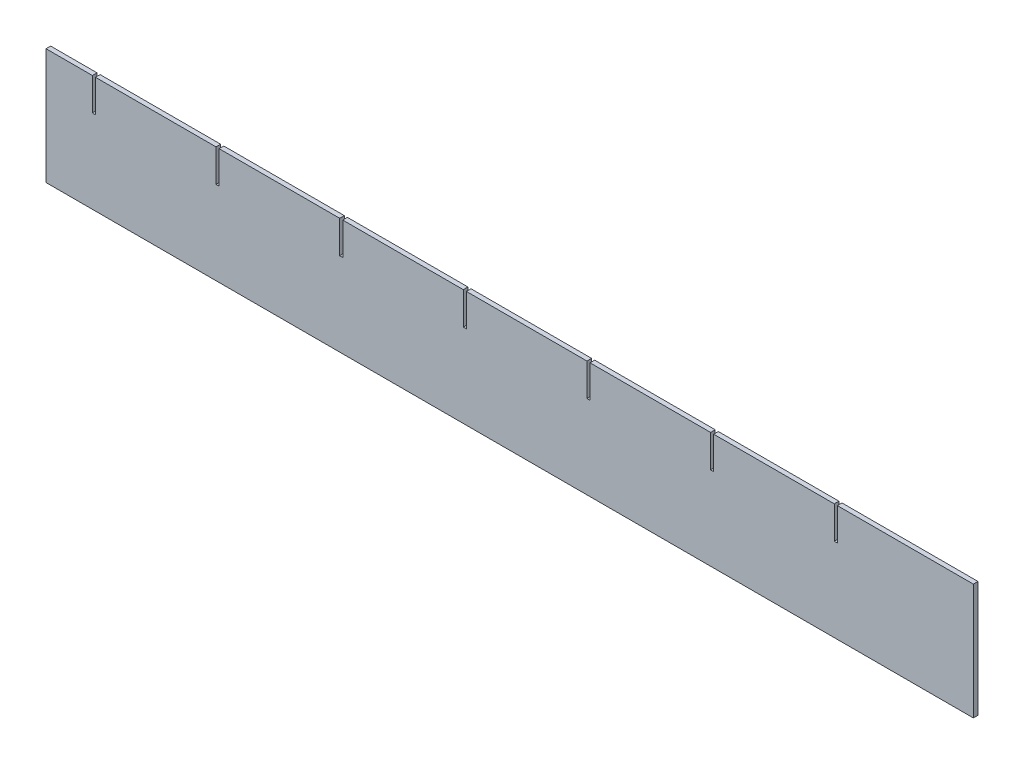
ISO-10303-21;
HEADER;
FILE_DESCRIPTION(('STEP AP214'),'2;1');
FILE_NAME('part.step','',(''),(''),'','','');
FILE_SCHEMA(('AUTOMOTIVE_DESIGN { 1 0 10303 214 1 1 1 1 }'));
ENDSEC;
DATA;
#1=APPLICATION_CONTEXT('core data for automotive mechanical design processes');
#2=APPLICATION_PROTOCOL_DEFINITION('international standard','automotive_design',2000,#1);
#3=PRODUCT_CONTEXT('',#1,'mechanical');
#4=PRODUCT('Part','Part','',(#3));
#5=PRODUCT_RELATED_PRODUCT_CATEGORY('part','',(#4));
#6=PRODUCT_DEFINITION_FORMATION('','',#4);
#7=PRODUCT_DEFINITION_CONTEXT('part definition',#1,'design');
#8=PRODUCT_DEFINITION('design','',#6,#7);
#9=PRODUCT_DEFINITION_SHAPE('','',#8);
#10=(LENGTH_UNIT() NAMED_UNIT(*) SI_UNIT(.MILLI.,.METRE.));
#11=(NAMED_UNIT(*) PLANE_ANGLE_UNIT() SI_UNIT($,.RADIAN.));
#12=(NAMED_UNIT(*) SI_UNIT($,.STERADIAN.) SOLID_ANGLE_UNIT());
#13=UNCERTAINTY_MEASURE_WITH_UNIT(LENGTH_MEASURE(1.E-05),#10,'distance_accuracy_value','');
#14=(GEOMETRIC_REPRESENTATION_CONTEXT(3) GLOBAL_UNCERTAINTY_ASSIGNED_CONTEXT((#13)) GLOBAL_UNIT_ASSIGNED_CONTEXT((#10,
#11,#12)) REPRESENTATION_CONTEXT('',''));
#15=CARTESIAN_POINT('',(0.,0.,0.));
#16=DIRECTION('',(0.,0.,1.));
#17=DIRECTION('',(1.,0.,0.));
#18=AXIS2_PLACEMENT_3D('',#15,#16,#17);
#19=CARTESIAN_POINT('',(0.,16.5,3.));
#20=DIRECTION('',(0.,1.,0.));
#21=DIRECTION('',(0.,0.,1.));
#22=AXIS2_PLACEMENT_3D('',#19,#20,#21);
#23=PLANE('',#22);
#24=DIRECTION('',(1.,0.,0.));
#25=VECTOR('',#24,1.);
#26=CARTESIAN_POINT('',(0.,16.5,0.));
#27=LINE('',#26,#25);
#28=CARTESIAN_POINT('',(210.,16.5,0.));
#29=VERTEX_POINT('',#28);
#30=CARTESIAN_POINT('',(212.,16.5,0.));
#31=VERTEX_POINT('',#30);
#32=EDGE_CURVE('E386',#29,#31,#27,.T.);
#33=ORIENTED_EDGE('',*,*,#32,.F.);
#34=DIRECTION('',(0.,0.,-1.));
#35=VECTOR('',#34,1.);
#36=CARTESIAN_POINT('',(210.,16.5,3.));
#37=LINE('',#36,#35);
#38=CARTESIAN_POINT('',(210.,16.5,3.));
#39=VERTEX_POINT('',#38);
#40=EDGE_CURVE('E11',#39,#29,#37,.T.);
#41=ORIENTED_EDGE('',*,*,#40,.F.);
#42=DIRECTION('',(1.,0.,0.));
#43=VECTOR('',#42,1.);
#44=CARTESIAN_POINT('',(0.,16.5,3.));
#45=LINE('',#44,#43);
#46=CARTESIAN_POINT('',(212.,16.5,3.));
#47=VERTEX_POINT('',#46);
#48=EDGE_CURVE('E304',#39,#47,#45,.T.);
#49=ORIENTED_EDGE('',*,*,#48,.T.);
#50=DIRECTION('',(0.,0.,-1.));
#51=VECTOR('',#50,1.);
#52=CARTESIAN_POINT('',(212.,16.5,3.));
#53=LINE('',#52,#51);
#54=EDGE_CURVE('E168',#47,#31,#53,.T.);
#55=ORIENTED_EDGE('',*,*,#54,.T.);
#56=EDGE_LOOP('',(#33,#41,#49,#55));
#57=FACE_BOUND('',#56,.T.);
#58=ADVANCED_FACE('F45',(#57),#23,.T.);
#59=CARTESIAN_POINT('',(210.,0.,3.));
#60=DIRECTION('',(1.,0.,0.));
#61=DIRECTION('',(0.,0.,-1.));
#62=AXIS2_PLACEMENT_3D('',#59,#60,#61);
#63=PLANE('',#62);
#64=DIRECTION('',(0.,-1.,0.));
#65=VECTOR('',#64,1.);
#66=CARTESIAN_POINT('',(210.,0.,0.));
#67=LINE('',#66,#65);
#68=CARTESIAN_POINT('',(210.,37.5,0.));
#69=VERTEX_POINT('',#68);
#70=EDGE_CURVE('E390',#69,#29,#67,.T.);
#71=ORIENTED_EDGE('',*,*,#70,.F.);
#72=DIRECTION('',(0.,0.,-1.));
#73=VECTOR('',#72,1.);
#74=CARTESIAN_POINT('',(210.,37.5,3.));
#75=LINE('',#74,#73);
#76=CARTESIAN_POINT('',(210.,37.5,3.));
#77=VERTEX_POINT('',#76);
#78=EDGE_CURVE('E54',#77,#69,#75,.T.);
#79=ORIENTED_EDGE('',*,*,#78,.F.);
#80=DIRECTION('',(0.,-1.,0.));
#81=VECTOR('',#80,1.);
#82=CARTESIAN_POINT('',(210.,0.,3.));
#83=LINE('',#82,#81);
#84=EDGE_CURVE('E296',#77,#39,#83,.T.);
#85=ORIENTED_EDGE('',*,*,#84,.T.);
#86=ORIENTED_EDGE('',*,*,#40,.T.);
#87=EDGE_LOOP('',(#71,#79,#85,#86));
#88=FACE_BOUND('',#87,.T.);
#89=ADVANCED_FACE('F582',(#88),#63,.T.);
#90=CARTESIAN_POINT('',(0.,37.5,3.));
#91=DIRECTION('',(0.,1.,0.));
#92=DIRECTION('',(-1.,0.,0.));
#93=AXIS2_PLACEMENT_3D('',#90,#91,#92);
#94=PLANE('',#93);
#95=DIRECTION('',(1.,0.,0.));
#96=VECTOR('',#95,1.);
#97=CARTESIAN_POINT('',(0.,37.5,0.));
#98=LINE('',#97,#96);
#99=CARTESIAN_POINT('',(132.,37.5,0.));
#100=VERTEX_POINT('',#99);
#101=EDGE_CURVE('E394',#100,#69,#98,.T.);
#102=ORIENTED_EDGE('',*,*,#101,.F.);
#103=DIRECTION('',(0.,0.,-1.));
#104=VECTOR('',#103,1.);
#105=CARTESIAN_POINT('',(132.,37.5,3.));
#106=LINE('',#105,#104);
#107=CARTESIAN_POINT('',(132.,37.5,3.));
#108=VERTEX_POINT('',#107);
#109=EDGE_CURVE('E574',#108,#100,#106,.T.);
#110=ORIENTED_EDGE('',*,*,#109,.F.);
#111=DIRECTION('',(1.,0.,0.));
#112=VECTOR('',#111,1.);
#113=CARTESIAN_POINT('',(0.,37.5,3.));
#114=LINE('',#113,#112);
#115=EDGE_CURVE('E283',#108,#77,#114,.T.);
#116=ORIENTED_EDGE('',*,*,#115,.T.);
#117=ORIENTED_EDGE('',*,*,#78,.T.);
#118=EDGE_LOOP('',(#102,#110,#116,#117));
#119=FACE_BOUND('',#118,.T.);
#120=ADVANCED_FACE('F579',(#119),#94,.T.);
#121=CARTESIAN_POINT('',(132.,0.,3.));
#122=DIRECTION('',(1.,0.,0.));
#123=DIRECTION('',(0.,0.,-1.));
#124=AXIS2_PLACEMENT_3D('',#121,#122,#123);
#125=PLANE('',#124);
#126=DIRECTION('',(0.,-1.,0.));
#127=VECTOR('',#126,1.);
#128=CARTESIAN_POINT('',(132.,0.,0.));
#129=LINE('',#128,#127);
#130=CARTESIAN_POINT('',(132.,16.5,0.));
#131=VERTEX_POINT('',#130);
#132=EDGE_CURVE('E398',#100,#131,#129,.T.);
#133=ORIENTED_EDGE('',*,*,#132,.T.);
#134=DIRECTION('',(0.,0.,-1.));
#135=VECTOR('',#134,1.);
#136=CARTESIAN_POINT('',(132.,16.5,3.));
#137=LINE('',#136,#135);
#138=CARTESIAN_POINT('',(132.,16.5,3.));
#139=VERTEX_POINT('',#138);
#140=EDGE_CURVE('E571',#139,#131,#137,.T.);
#141=ORIENTED_EDGE('',*,*,#140,.F.);
#142=DIRECTION('',(0.,-1.,0.));
#143=VECTOR('',#142,1.);
#144=CARTESIAN_POINT('',(132.,0.,3.));
#145=LINE('',#144,#143);
#146=EDGE_CURVE('E295',#108,#139,#145,.T.);
#147=ORIENTED_EDGE('',*,*,#146,.F.);
#148=ORIENTED_EDGE('',*,*,#109,.T.);
#149=EDGE_LOOP('',(#133,#141,#147,#148));
#150=FACE_BOUND('',#149,.T.);
#151=ADVANCED_FACE('F589',(#150),#125,.F.);
#152=CARTESIAN_POINT('',(0.,16.5,3.));
#153=DIRECTION('',(0.,1.,0.));
#154=DIRECTION('',(0.,0.,1.));
#155=AXIS2_PLACEMENT_3D('',#152,#153,#154);
#156=PLANE('',#155);
#157=DIRECTION('',(1.,0.,0.));
#158=VECTOR('',#157,1.);
#159=CARTESIAN_POINT('',(0.,16.5,0.));
#160=LINE('',#159,#158);
#161=CARTESIAN_POINT('',(130.,16.5,0.));
#162=VERTEX_POINT('',#161);
#163=EDGE_CURVE('E404',#162,#131,#160,.T.);
#164=ORIENTED_EDGE('',*,*,#163,.F.);
#165=DIRECTION('',(0.,0.,-1.));
#166=VECTOR('',#165,1.);
#167=CARTESIAN_POINT('',(130.,16.5,3.));
#168=LINE('',#167,#166);
#169=CARTESIAN_POINT('',(130.,16.5,3.));
#170=VERTEX_POINT('',#169);
#171=EDGE_CURVE('E568',#170,#162,#168,.T.);
#172=ORIENTED_EDGE('',*,*,#171,.F.);
#173=DIRECTION('',(1.,0.,0.));
#174=VECTOR('',#173,1.);
#175=CARTESIAN_POINT('',(0.,16.5,3.));
#176=LINE('',#175,#174);
#177=EDGE_CURVE('E302',#170,#139,#176,.T.);
#178=ORIENTED_EDGE('',*,*,#177,.T.);
#179=ORIENTED_EDGE('',*,*,#140,.T.);
#180=EDGE_LOOP('',(#164,#172,#178,#179));
#181=FACE_BOUND('',#180,.T.);
#182=ADVANCED_FACE('F615',(#181),#156,.T.);
#183=CARTESIAN_POINT('',(130.,0.,3.));
#184=DIRECTION('',(1.,0.,0.));
#185=DIRECTION('',(0.,0.,-1.));
#186=AXIS2_PLACEMENT_3D('',#183,#184,#185);
#187=PLANE('',#186);
#188=DIRECTION('',(0.,-1.,0.));
#189=VECTOR('',#188,1.);
#190=CARTESIAN_POINT('',(130.,0.,0.));
#191=LINE('',#190,#189);
#192=CARTESIAN_POINT('',(130.,37.5,0.));
#193=VERTEX_POINT('',#192);
#194=EDGE_CURVE('E408',#193,#162,#191,.T.);
#195=ORIENTED_EDGE('',*,*,#194,.F.);
#196=DIRECTION('',(0.,0.,-1.));
#197=VECTOR('',#196,1.);
#198=CARTESIAN_POINT('',(130.,37.5,3.));
#199=LINE('',#198,#197);
#200=CARTESIAN_POINT('',(130.,37.5,3.));
#201=VERTEX_POINT('',#200);
#202=EDGE_CURVE('E565',#201,#193,#199,.T.);
#203=ORIENTED_EDGE('',*,*,#202,.F.);
#204=DIRECTION('',(0.,-1.,0.));
#205=VECTOR('',#204,1.);
#206=CARTESIAN_POINT('',(130.,0.,3.));
#207=LINE('',#206,#205);
#208=EDGE_CURVE('E308',#201,#170,#207,.T.);
#209=ORIENTED_EDGE('',*,*,#208,.T.);
#210=ORIENTED_EDGE('',*,*,#171,.T.);
#211=EDGE_LOOP('',(#195,#203,#209,#210));
#212=FACE_BOUND('',#211,.T.);
#213=ADVANCED_FACE('F613',(#212),#187,.T.);
#214=CARTESIAN_POINT('',(52.,37.5,0.));
#215=VERTEX_POINT('',#214);
#216=EDGE_CURVE('E400',#215,#193,#98,.T.);
#217=ORIENTED_EDGE('',*,*,#216,.F.);
#218=DIRECTION('',(0.,0.,-1.));
#219=VECTOR('',#218,1.);
#220=CARTESIAN_POINT('',(52.,37.5,3.));
#221=LINE('',#220,#219);
#222=CARTESIAN_POINT('',(52.,37.5,3.));
#223=VERTEX_POINT('',#222);
#224=EDGE_CURVE('E562',#223,#215,#221,.T.);
#225=ORIENTED_EDGE('',*,*,#224,.F.);
#226=EDGE_CURVE('E297',#223,#201,#114,.T.);
#227=ORIENTED_EDGE('',*,*,#226,.T.);
#228=ORIENTED_EDGE('',*,*,#202,.T.);
#229=EDGE_LOOP('',(#217,#225,#227,#228));
#230=FACE_BOUND('',#229,.T.);
#231=ADVANCED_FACE('F609',(#230),#94,.T.);
#232=CARTESIAN_POINT('',(52.,0.,3.));
#233=DIRECTION('',(1.,0.,0.));
#234=DIRECTION('',(0.,0.,-1.));
#235=AXIS2_PLACEMENT_3D('',#232,#233,#234);
#236=PLANE('',#235);
#237=DIRECTION('',(0.,-1.,0.));
#238=VECTOR('',#237,1.);
#239=CARTESIAN_POINT('',(52.,0.,0.));
#240=LINE('',#239,#238);
#241=CARTESIAN_POINT('',(52.,16.5,0.));
#242=VERTEX_POINT('',#241);
#243=EDGE_CURVE('E412',#215,#242,#240,.T.);
#244=ORIENTED_EDGE('',*,*,#243,.T.);
#245=DIRECTION('',(0.,0.,-1.));
#246=VECTOR('',#245,1.);
#247=CARTESIAN_POINT('',(52.,16.5,3.));
#248=LINE('',#247,#246);
#249=CARTESIAN_POINT('',(52.,16.5,3.));
#250=VERTEX_POINT('',#249);
#251=EDGE_CURVE('E559',#250,#242,#248,.T.);
#252=ORIENTED_EDGE('',*,*,#251,.F.);
#253=DIRECTION('',(0.,-1.,0.));
#254=VECTOR('',#253,1.);
#255=CARTESIAN_POINT('',(52.,0.,3.));
#256=LINE('',#255,#254);
#257=EDGE_CURVE('E307',#223,#250,#256,.T.);
#258=ORIENTED_EDGE('',*,*,#257,.F.);
#259=ORIENTED_EDGE('',*,*,#224,.T.);
#260=EDGE_LOOP('',(#244,#252,#258,#259));
#261=FACE_BOUND('',#260,.T.);
#262=ADVANCED_FACE('F714',(#261),#236,.F.);
#263=CARTESIAN_POINT('',(0.,16.5,3.));
#264=DIRECTION('',(0.,1.,0.));
#265=DIRECTION('',(0.,0.,1.));
#266=AXIS2_PLACEMENT_3D('',#263,#264,#265);
#267=PLANE('',#266);
#268=DIRECTION('',(1.,0.,0.));
#269=VECTOR('',#268,1.);
#270=CARTESIAN_POINT('',(0.,16.5,0.));
#271=LINE('',#270,#269);
#272=CARTESIAN_POINT('',(50.,16.5,0.));
#273=VERTEX_POINT('',#272);
#274=EDGE_CURVE('E416',#273,#242,#271,.T.);
#275=ORIENTED_EDGE('',*,*,#274,.F.);
#276=DIRECTION('',(0.,0.,-1.));
#277=VECTOR('',#276,1.);
#278=CARTESIAN_POINT('',(50.,16.5,3.));
#279=LINE('',#278,#277);
#280=CARTESIAN_POINT('',(50.,16.5,3.));
#281=VERTEX_POINT('',#280);
#282=EDGE_CURVE('E556',#281,#273,#279,.T.);
#283=ORIENTED_EDGE('',*,*,#282,.F.);
#284=DIRECTION('',(1.,0.,0.));
#285=VECTOR('',#284,1.);
#286=CARTESIAN_POINT('',(0.,16.5,3.));
#287=LINE('',#286,#285);
#288=EDGE_CURVE('E314',#281,#250,#287,.T.);
#289=ORIENTED_EDGE('',*,*,#288,.T.);
#290=ORIENTED_EDGE('',*,*,#251,.T.);
#291=EDGE_LOOP('',(#275,#283,#289,#290));
#292=FACE_BOUND('',#291,.T.);
#293=ADVANCED_FACE('F717',(#292),#267,.T.);
#294=CARTESIAN_POINT('',(50.,0.,3.));
#295=DIRECTION('',(1.,0.,0.));
#296=DIRECTION('',(0.,0.,-1.));
#297=AXIS2_PLACEMENT_3D('',#294,#295,#296);
#298=PLANE('',#297);
#299=DIRECTION('',(0.,-1.,0.));
#300=VECTOR('',#299,1.);
#301=CARTESIAN_POINT('',(50.,0.,0.));
#302=LINE('',#301,#300);
#303=CARTESIAN_POINT('',(50.,37.5,0.));
#304=VERTEX_POINT('',#303);
#305=EDGE_CURVE('E420',#304,#273,#302,.T.);
#306=ORIENTED_EDGE('',*,*,#305,.F.);
#307=DIRECTION('',(0.,0.,-1.));
#308=VECTOR('',#307,1.);
#309=CARTESIAN_POINT('',(50.,37.5,3.));
#310=LINE('',#309,#308);
#311=CARTESIAN_POINT('',(50.,37.5,3.));
#312=VERTEX_POINT('',#311);
#313=EDGE_CURVE('E553',#312,#304,#310,.T.);
#314=ORIENTED_EDGE('',*,*,#313,.F.);
#315=DIRECTION('',(0.,-1.,0.));
#316=VECTOR('',#315,1.);
#317=CARTESIAN_POINT('',(50.,0.,3.));
#318=LINE('',#317,#316);
#319=EDGE_CURVE('E321',#312,#281,#318,.T.);
#320=ORIENTED_EDGE('',*,*,#319,.T.);
#321=ORIENTED_EDGE('',*,*,#282,.T.);
#322=EDGE_LOOP('',(#306,#314,#320,#321));
#323=FACE_BOUND('',#322,.T.);
#324=ADVANCED_FACE('F721',(#323),#298,.T.);
#325=CARTESIAN_POINT('',(-28.,37.5,0.));
#326=VERTEX_POINT('',#325);
#327=EDGE_CURVE('E424',#326,#304,#98,.T.);
#328=ORIENTED_EDGE('',*,*,#327,.F.);
#329=DIRECTION('',(0.,0.,-1.));
#330=VECTOR('',#329,1.);
#331=CARTESIAN_POINT('',(-28.,37.5,3.));
#332=LINE('',#331,#330);
#333=CARTESIAN_POINT('',(-28.,37.5,3.));
#334=VERTEX_POINT('',#333);
#335=EDGE_CURVE('E550',#334,#326,#332,.T.);
#336=ORIENTED_EDGE('',*,*,#335,.F.);
#337=EDGE_CURVE('E309',#334,#312,#114,.T.);
#338=ORIENTED_EDGE('',*,*,#337,.T.);
#339=ORIENTED_EDGE('',*,*,#313,.T.);
#340=EDGE_LOOP('',(#328,#336,#338,#339));
#341=FACE_BOUND('',#340,.T.);
#342=ADVANCED_FACE('F725',(#341),#94,.T.);
#343=CARTESIAN_POINT('',(-28.,0.,3.));
#344=DIRECTION('',(1.,0.,0.));
#345=DIRECTION('',(0.,0.,-1.));
#346=AXIS2_PLACEMENT_3D('',#343,#344,#345);
#347=PLANE('',#346);
#348=DIRECTION('',(0.,-1.,0.));
#349=VECTOR('',#348,1.);
#350=CARTESIAN_POINT('',(-28.,0.,0.));
#351=LINE('',#350,#349);
#352=CARTESIAN_POINT('',(-28.,16.5,0.));
#353=VERTEX_POINT('',#352);
#354=EDGE_CURVE('E425',#326,#353,#351,.T.);
#355=ORIENTED_EDGE('',*,*,#354,.T.);
#356=DIRECTION('',(0.,0.,-1.));
#357=VECTOR('',#356,1.);
#358=CARTESIAN_POINT('',(-28.,16.5,3.));
#359=LINE('',#358,#357);
#360=CARTESIAN_POINT('',(-28.,16.5,3.));
#361=VERTEX_POINT('',#360);
#362=EDGE_CURVE('E547',#361,#353,#359,.T.);
#363=ORIENTED_EDGE('',*,*,#362,.F.);
#364=DIRECTION('',(0.,-1.,0.));
#365=VECTOR('',#364,1.);
#366=CARTESIAN_POINT('',(-28.,0.,3.));
#367=LINE('',#366,#365);
#368=EDGE_CURVE('E320',#334,#361,#367,.T.);
#369=ORIENTED_EDGE('',*,*,#368,.F.);
#370=ORIENTED_EDGE('',*,*,#335,.T.);
#371=EDGE_LOOP('',(#355,#363,#369,#370));
#372=FACE_BOUND('',#371,.T.);
#373=ADVANCED_FACE('F727',(#372),#347,.F.);
#374=CARTESIAN_POINT('',(0.,16.5,3.));
#375=DIRECTION('',(0.,1.,0.));
#376=DIRECTION('',(0.,0.,1.));
#377=AXIS2_PLACEMENT_3D('',#374,#375,#376);
#378=PLANE('',#377);
#379=DIRECTION('',(1.,0.,0.));
#380=VECTOR('',#379,1.);
#381=CARTESIAN_POINT('',(0.,16.5,0.));
#382=LINE('',#381,#380);
#383=CARTESIAN_POINT('',(-30.,16.5,0.));
#384=VERTEX_POINT('',#383);
#385=EDGE_CURVE('E429',#384,#353,#382,.T.);
#386=ORIENTED_EDGE('',*,*,#385,.F.);
#387=DIRECTION('',(0.,0.,-1.));
#388=VECTOR('',#387,1.);
#389=CARTESIAN_POINT('',(-30.,16.5,3.));
#390=LINE('',#389,#388);
#391=CARTESIAN_POINT('',(-30.,16.5,3.));
#392=VERTEX_POINT('',#391);
#393=EDGE_CURVE('E544',#392,#384,#390,.T.);
#394=ORIENTED_EDGE('',*,*,#393,.F.);
#395=DIRECTION('',(1.,0.,0.));
#396=VECTOR('',#395,1.);
#397=CARTESIAN_POINT('',(0.,16.5,3.));
#398=LINE('',#397,#396);
#399=EDGE_CURVE('E327',#392,#361,#398,.T.);
#400=ORIENTED_EDGE('',*,*,#399,.T.);
#401=ORIENTED_EDGE('',*,*,#362,.T.);
#402=EDGE_LOOP('',(#386,#394,#400,#401));
#403=FACE_BOUND('',#402,.T.);
#404=ADVANCED_FACE('F627',(#403),#378,.T.);
#405=CARTESIAN_POINT('',(-30.,0.,3.));
#406=DIRECTION('',(1.,0.,0.));
#407=DIRECTION('',(0.,0.,-1.));
#408=AXIS2_PLACEMENT_3D('',#405,#406,#407);
#409=PLANE('',#408);
#410=DIRECTION('',(0.,-1.,0.));
#411=VECTOR('',#410,1.);
#412=CARTESIAN_POINT('',(-30.,0.,0.));
#413=LINE('',#412,#411);
#414=CARTESIAN_POINT('',(-30.,37.5,0.));
#415=VERTEX_POINT('',#414);
#416=EDGE_CURVE('E433',#415,#384,#413,.T.);
#417=ORIENTED_EDGE('',*,*,#416,.F.);
#418=DIRECTION('',(0.,0.,-1.));
#419=VECTOR('',#418,1.);
#420=CARTESIAN_POINT('',(-30.,37.5,3.));
#421=LINE('',#420,#419);
#422=CARTESIAN_POINT('',(-30.,37.5,3.));
#423=VERTEX_POINT('',#422);
#424=EDGE_CURVE('E541',#423,#415,#421,.T.);
#425=ORIENTED_EDGE('',*,*,#424,.F.);
#426=DIRECTION('',(0.,-1.,0.));
#427=VECTOR('',#426,1.);
#428=CARTESIAN_POINT('',(-30.,0.,3.));
#429=LINE('',#428,#427);
#430=EDGE_CURVE('E334',#423,#392,#429,.T.);
#431=ORIENTED_EDGE('',*,*,#430,.T.);
#432=ORIENTED_EDGE('',*,*,#393,.T.);
#433=EDGE_LOOP('',(#417,#425,#431,#432));
#434=FACE_BOUND('',#433,.T.);
#435=ADVANCED_FACE('F633',(#434),#409,.T.);
#436=CARTESIAN_POINT('',(-108.,37.5,0.));
#437=VERTEX_POINT('',#436);
#438=EDGE_CURVE('E437',#437,#415,#98,.T.);
#439=ORIENTED_EDGE('',*,*,#438,.F.);
#440=DIRECTION('',(0.,0.,-1.));
#441=VECTOR('',#440,1.);
#442=CARTESIAN_POINT('',(-108.,37.5,3.));
#443=LINE('',#442,#441);
#444=CARTESIAN_POINT('',(-108.,37.5,3.));
#445=VERTEX_POINT('',#444);
#446=EDGE_CURVE('E538',#445,#437,#443,.T.);
#447=ORIENTED_EDGE('',*,*,#446,.F.);
#448=EDGE_CURVE('E322',#445,#423,#114,.T.);
#449=ORIENTED_EDGE('',*,*,#448,.T.);
#450=ORIENTED_EDGE('',*,*,#424,.T.);
#451=EDGE_LOOP('',(#439,#447,#449,#450));
#452=FACE_BOUND('',#451,.T.);
#453=ADVANCED_FACE('F635',(#452),#94,.T.);
#454=CARTESIAN_POINT('',(-108.,0.,3.));
#455=DIRECTION('',(1.,0.,0.));
#456=DIRECTION('',(0.,0.,-1.));
#457=AXIS2_PLACEMENT_3D('',#454,#455,#456);
#458=PLANE('',#457);
#459=DIRECTION('',(0.,-1.,0.));
#460=VECTOR('',#459,1.);
#461=CARTESIAN_POINT('',(-108.,0.,0.));
#462=LINE('',#461,#460);
#463=CARTESIAN_POINT('',(-108.,16.5,0.));
#464=VERTEX_POINT('',#463);
#465=EDGE_CURVE('E438',#437,#464,#462,.T.);
#466=ORIENTED_EDGE('',*,*,#465,.T.);
#467=DIRECTION('',(0.,0.,-1.));
#468=VECTOR('',#467,1.);
#469=CARTESIAN_POINT('',(-108.,16.5,3.));
#470=LINE('',#469,#468);
#471=CARTESIAN_POINT('',(-108.,16.5,3.));
#472=VERTEX_POINT('',#471);
#473=EDGE_CURVE('E535',#472,#464,#470,.T.);
#474=ORIENTED_EDGE('',*,*,#473,.F.);
#475=DIRECTION('',(0.,-1.,0.));
#476=VECTOR('',#475,1.);
#477=CARTESIAN_POINT('',(-108.,0.,3.));
#478=LINE('',#477,#476);
#479=EDGE_CURVE('E333',#445,#472,#478,.T.);
#480=ORIENTED_EDGE('',*,*,#479,.F.);
#481=ORIENTED_EDGE('',*,*,#446,.T.);
#482=EDGE_LOOP('',(#466,#474,#480,#481));
#483=FACE_BOUND('',#482,.T.);
#484=ADVANCED_FACE('F641',(#483),#458,.F.);
#485=CARTESIAN_POINT('',(0.,16.5,3.));
#486=DIRECTION('',(0.,1.,0.));
#487=DIRECTION('',(0.,0.,1.));
#488=AXIS2_PLACEMENT_3D('',#485,#486,#487);
#489=PLANE('',#488);
#490=DIRECTION('',(1.,0.,0.));
#491=VECTOR('',#490,1.);
#492=CARTESIAN_POINT('',(0.,16.5,0.));
#493=LINE('',#492,#491);
#494=CARTESIAN_POINT('',(-110.,16.5,0.));
#495=VERTEX_POINT('',#494);
#496=EDGE_CURVE('E442',#495,#464,#493,.T.);
#497=ORIENTED_EDGE('',*,*,#496,.F.);
#498=DIRECTION('',(0.,0.,-1.));
#499=VECTOR('',#498,1.);
#500=CARTESIAN_POINT('',(-110.,16.5,3.));
#501=LINE('',#500,#499);
#502=CARTESIAN_POINT('',(-110.,16.5,3.));
#503=VERTEX_POINT('',#502);
#504=EDGE_CURVE('E532',#503,#495,#501,.T.);
#505=ORIENTED_EDGE('',*,*,#504,.F.);
#506=DIRECTION('',(1.,0.,0.));
#507=VECTOR('',#506,1.);
#508=CARTESIAN_POINT('',(0.,16.5,3.));
#509=LINE('',#508,#507);
#510=EDGE_CURVE('E339',#503,#472,#509,.T.);
#511=ORIENTED_EDGE('',*,*,#510,.T.);
#512=ORIENTED_EDGE('',*,*,#473,.T.);
#513=EDGE_LOOP('',(#497,#505,#511,#512));
#514=FACE_BOUND('',#513,.T.);
#515=ADVANCED_FACE('F644',(#514),#489,.T.);
#516=CARTESIAN_POINT('',(-110.,0.,3.));
#517=DIRECTION('',(1.,0.,0.));
#518=DIRECTION('',(0.,0.,-1.));
#519=AXIS2_PLACEMENT_3D('',#516,#517,#518);
#520=PLANE('',#519);
#521=DIRECTION('',(0.,-1.,0.));
#522=VECTOR('',#521,1.);
#523=CARTESIAN_POINT('',(-110.,0.,0.));
#524=LINE('',#523,#522);
#525=CARTESIAN_POINT('',(-110.,37.5,0.));
#526=VERTEX_POINT('',#525);
#527=EDGE_CURVE('E446',#526,#495,#524,.T.);
#528=ORIENTED_EDGE('',*,*,#527,.F.);
#529=DIRECTION('',(0.,0.,-1.));
#530=VECTOR('',#529,1.);
#531=CARTESIAN_POINT('',(-110.,37.5,3.));
#532=LINE('',#531,#530);
#533=CARTESIAN_POINT('',(-110.,37.5,3.));
#534=VERTEX_POINT('',#533);
#535=EDGE_CURVE('E529',#534,#526,#532,.T.);
#536=ORIENTED_EDGE('',*,*,#535,.F.);
#537=DIRECTION('',(0.,-1.,0.));
#538=VECTOR('',#537,1.);
#539=CARTESIAN_POINT('',(-110.,0.,3.));
#540=LINE('',#539,#538);
#541=EDGE_CURVE('E346',#534,#503,#540,.T.);
#542=ORIENTED_EDGE('',*,*,#541,.T.);
#543=ORIENTED_EDGE('',*,*,#504,.T.);
#544=EDGE_LOOP('',(#528,#536,#542,#543));
#545=FACE_BOUND('',#544,.T.);
#546=ADVANCED_FACE('F646',(#545),#520,.T.);
#547=CARTESIAN_POINT('',(-188.,37.5,0.));
#548=VERTEX_POINT('',#547);
#549=EDGE_CURVE('E450',#548,#526,#98,.T.);
#550=ORIENTED_EDGE('',*,*,#549,.F.);
#551=DIRECTION('',(0.,0.,-1.));
#552=VECTOR('',#551,1.);
#553=CARTESIAN_POINT('',(-188.,37.5,3.));
#554=LINE('',#553,#552);
#555=CARTESIAN_POINT('',(-188.,37.5,3.));
#556=VERTEX_POINT('',#555);
#557=EDGE_CURVE('E526',#556,#548,#554,.T.);
#558=ORIENTED_EDGE('',*,*,#557,.F.);
#559=EDGE_CURVE('E292',#556,#534,#114,.T.);
#560=ORIENTED_EDGE('',*,*,#559,.T.);
#561=ORIENTED_EDGE('',*,*,#535,.T.);
#562=EDGE_LOOP('',(#550,#558,#560,#561));
#563=FACE_BOUND('',#562,.T.);
#564=ADVANCED_FACE('F649',(#563),#94,.T.);
#565=CARTESIAN_POINT('',(-188.,0.,3.));
#566=DIRECTION('',(1.,0.,0.));
#567=DIRECTION('',(0.,0.,-1.));
#568=AXIS2_PLACEMENT_3D('',#565,#566,#567);
#569=PLANE('',#568);
#570=DIRECTION('',(0.,-1.,0.));
#571=VECTOR('',#570,1.);
#572=CARTESIAN_POINT('',(-188.,0.,0.));
#573=LINE('',#572,#571);
#574=CARTESIAN_POINT('',(-188.,16.5,0.));
#575=VERTEX_POINT('',#574);
#576=EDGE_CURVE('E451',#548,#575,#573,.T.);
#577=ORIENTED_EDGE('',*,*,#576,.T.);
#578=DIRECTION('',(0.,0.,-1.));
#579=VECTOR('',#578,1.);
#580=CARTESIAN_POINT('',(-188.,16.5,3.));
#581=LINE('',#580,#579);
#582=CARTESIAN_POINT('',(-188.,16.5,3.));
#583=VERTEX_POINT('',#582);
#584=EDGE_CURVE('E523',#583,#575,#581,.T.);
#585=ORIENTED_EDGE('',*,*,#584,.F.);
#586=DIRECTION('',(0.,-1.,0.));
#587=VECTOR('',#586,1.);
#588=CARTESIAN_POINT('',(-188.,0.,3.));
#589=LINE('',#588,#587);
#590=EDGE_CURVE('E345',#556,#583,#589,.T.);
#591=ORIENTED_EDGE('',*,*,#590,.F.);
#592=ORIENTED_EDGE('',*,*,#557,.T.);
#593=EDGE_LOOP('',(#577,#585,#591,#592));
#594=FACE_BOUND('',#593,.T.);
#595=ADVANCED_FACE('F653',(#594),#569,.F.);
#596=CARTESIAN_POINT('',(0.,16.5,3.));
#597=DIRECTION('',(0.,1.,0.));
#598=DIRECTION('',(0.,0.,1.));
#599=AXIS2_PLACEMENT_3D('',#596,#597,#598);
#600=PLANE('',#599);
#601=DIRECTION('',(1.,0.,0.));
#602=VECTOR('',#601,1.);
#603=CARTESIAN_POINT('',(0.,16.5,0.));
#604=LINE('',#603,#602);
#605=CARTESIAN_POINT('',(-190.,16.5,0.));
#606=VERTEX_POINT('',#605);
#607=EDGE_CURVE('E455',#606,#575,#604,.T.);
#608=ORIENTED_EDGE('',*,*,#607,.F.);
#609=DIRECTION('',(0.,0.,-1.));
#610=VECTOR('',#609,1.);
#611=CARTESIAN_POINT('',(-190.,16.5,3.));
#612=LINE('',#611,#610);
#613=CARTESIAN_POINT('',(-190.,16.5,3.));
#614=VERTEX_POINT('',#613);
#615=EDGE_CURVE('E520',#614,#606,#612,.T.);
#616=ORIENTED_EDGE('',*,*,#615,.F.);
#617=DIRECTION('',(1.,0.,0.));
#618=VECTOR('',#617,1.);
#619=CARTESIAN_POINT('',(0.,16.5,3.));
#620=LINE('',#619,#618);
#621=EDGE_CURVE('E351',#614,#583,#620,.T.);
#622=ORIENTED_EDGE('',*,*,#621,.T.);
#623=ORIENTED_EDGE('',*,*,#584,.T.);
#624=EDGE_LOOP('',(#608,#616,#622,#623));
#625=FACE_BOUND('',#624,.T.);
#626=ADVANCED_FACE('F743',(#625),#600,.T.);
#627=CARTESIAN_POINT('',(-190.,0.,3.));
#628=DIRECTION('',(1.,0.,0.));
#629=DIRECTION('',(0.,0.,-1.));
#630=AXIS2_PLACEMENT_3D('',#627,#628,#629);
#631=PLANE('',#630);
#632=DIRECTION('',(0.,-1.,0.));
#633=VECTOR('',#632,1.);
#634=CARTESIAN_POINT('',(-190.,0.,0.));
#635=LINE('',#634,#633);
#636=CARTESIAN_POINT('',(-190.,37.5,0.));
#637=VERTEX_POINT('',#636);
#638=EDGE_CURVE('E459',#637,#606,#635,.T.);
#639=ORIENTED_EDGE('',*,*,#638,.F.);
#640=DIRECTION('',(0.,0.,-1.));
#641=VECTOR('',#640,1.);
#642=CARTESIAN_POINT('',(-190.,37.5,3.));
#643=LINE('',#642,#641);
#644=CARTESIAN_POINT('',(-190.,37.5,3.));
#645=VERTEX_POINT('',#644);
#646=EDGE_CURVE('E517',#645,#637,#643,.T.);
#647=ORIENTED_EDGE('',*,*,#646,.F.);
#648=DIRECTION('',(0.,-1.,0.));
#649=VECTOR('',#648,1.);
#650=CARTESIAN_POINT('',(-190.,0.,3.));
#651=LINE('',#650,#649);
#652=EDGE_CURVE('E291',#645,#614,#651,.T.);
#653=ORIENTED_EDGE('',*,*,#652,.T.);
#654=ORIENTED_EDGE('',*,*,#615,.T.);
#655=EDGE_LOOP('',(#639,#647,#653,#654));
#656=FACE_BOUND('',#655,.T.);
#657=ADVANCED_FACE('F660',(#656),#631,.T.);
#658=CARTESIAN_POINT('',(-268.,37.5,0.));
#659=VERTEX_POINT('',#658);
#660=EDGE_CURVE('E463',#659,#637,#98,.T.);
#661=ORIENTED_EDGE('',*,*,#660,.F.);
#662=DIRECTION('',(0.,0.,-1.));
#663=VECTOR('',#662,1.);
#664=CARTESIAN_POINT('',(-268.,37.5,3.));
#665=LINE('',#664,#663);
#666=CARTESIAN_POINT('',(-268.,37.5,3.));
#667=VERTEX_POINT('',#666);
#668=EDGE_CURVE('E514',#667,#659,#665,.T.);
#669=ORIENTED_EDGE('',*,*,#668,.F.);
#670=EDGE_CURVE('E282',#667,#645,#114,.T.);
#671=ORIENTED_EDGE('',*,*,#670,.T.);
#672=ORIENTED_EDGE('',*,*,#646,.T.);
#673=EDGE_LOOP('',(#661,#669,#671,#672));
#674=FACE_BOUND('',#673,.T.);
#675=ADVANCED_FACE('F664',(#674),#94,.T.);
#676=CARTESIAN_POINT('',(-268.,0.,3.));
#677=DIRECTION('',(1.,0.,0.));
#678=DIRECTION('',(0.,0.,-1.));
#679=AXIS2_PLACEMENT_3D('',#676,#677,#678);
#680=PLANE('',#679);
#681=DIRECTION('',(0.,-1.,0.));
#682=VECTOR('',#681,1.);
#683=CARTESIAN_POINT('',(-268.,0.,0.));
#684=LINE('',#683,#682);
#685=CARTESIAN_POINT('',(-268.,16.5,0.));
#686=VERTEX_POINT('',#685);
#687=EDGE_CURVE('E464',#659,#686,#684,.T.);
#688=ORIENTED_EDGE('',*,*,#687,.T.);
#689=DIRECTION('',(0.,0.,-1.));
#690=VECTOR('',#689,1.);
#691=CARTESIAN_POINT('',(-268.,16.5,3.));
#692=LINE('',#691,#690);
#693=CARTESIAN_POINT('',(-268.,16.5,3.));
#694=VERTEX_POINT('',#693);
#695=EDGE_CURVE('E511',#694,#686,#692,.T.);
#696=ORIENTED_EDGE('',*,*,#695,.F.);
#697=DIRECTION('',(0.,-1.,0.));
#698=VECTOR('',#697,1.);
#699=CARTESIAN_POINT('',(-268.,0.,3.));
#700=LINE('',#699,#698);
#701=EDGE_CURVE('E290',#667,#694,#700,.T.);
#702=ORIENTED_EDGE('',*,*,#701,.F.);
#703=ORIENTED_EDGE('',*,*,#668,.T.);
#704=EDGE_LOOP('',(#688,#696,#702,#703));
#705=FACE_BOUND('',#704,.T.);
#706=ADVANCED_FACE('F670',(#705),#680,.F.);
#707=CARTESIAN_POINT('',(0.,16.5,3.));
#708=DIRECTION('',(0.,1.,0.));
#709=DIRECTION('',(0.,0.,1.));
#710=AXIS2_PLACEMENT_3D('',#707,#708,#709);
#711=PLANE('',#710);
#712=DIRECTION('',(1.,0.,0.));
#713=VECTOR('',#712,1.);
#714=CARTESIAN_POINT('',(0.,16.5,0.));
#715=LINE('',#714,#713);
#716=CARTESIAN_POINT('',(-270.,16.5,0.));
#717=VERTEX_POINT('',#716);
#718=EDGE_CURVE('E468',#717,#686,#715,.T.);
#719=ORIENTED_EDGE('',*,*,#718,.F.);
#720=DIRECTION('',(0.,0.,-1.));
#721=VECTOR('',#720,1.);
#722=CARTESIAN_POINT('',(-270.,16.5,3.));
#723=LINE('',#722,#721);
#724=CARTESIAN_POINT('',(-270.,16.5,3.));
#725=VERTEX_POINT('',#724);
#726=EDGE_CURVE('E508',#725,#717,#723,.T.);
#727=ORIENTED_EDGE('',*,*,#726,.F.);
#728=DIRECTION('',(1.,0.,0.));
#729=VECTOR('',#728,1.);
#730=CARTESIAN_POINT('',(0.,16.5,3.));
#731=LINE('',#730,#729);
#732=EDGE_CURVE('E369',#725,#694,#731,.T.);
#733=ORIENTED_EDGE('',*,*,#732,.T.);
#734=ORIENTED_EDGE('',*,*,#695,.T.);
#735=EDGE_LOOP('',(#719,#727,#733,#734));
#736=FACE_BOUND('',#735,.T.);
#737=ADVANCED_FACE('F674',(#736),#711,.T.);
#738=CARTESIAN_POINT('',(-270.,0.,3.));
#739=DIRECTION('',(1.,0.,0.));
#740=DIRECTION('',(0.,0.,-1.));
#741=AXIS2_PLACEMENT_3D('',#738,#739,#740);
#742=PLANE('',#741);
#743=DIRECTION('',(0.,-1.,0.));
#744=VECTOR('',#743,1.);
#745=CARTESIAN_POINT('',(-270.,0.,0.));
#746=LINE('',#745,#744);
#747=CARTESIAN_POINT('',(-270.,37.5,0.));
#748=VERTEX_POINT('',#747);
#749=EDGE_CURVE('E472',#748,#717,#746,.T.);
#750=ORIENTED_EDGE('',*,*,#749,.F.);
#751=DIRECTION('',(0.,0.,-1.));
#752=VECTOR('',#751,1.);
#753=CARTESIAN_POINT('',(-270.,37.5,3.));
#754=LINE('',#753,#752);
#755=CARTESIAN_POINT('',(-270.,37.5,3.));
#756=VERTEX_POINT('',#755);
#757=EDGE_CURVE('E505',#756,#748,#754,.T.);
#758=ORIENTED_EDGE('',*,*,#757,.F.);
#759=DIRECTION('',(0.,-1.,0.));
#760=VECTOR('',#759,1.);
#761=CARTESIAN_POINT('',(-270.,0.,3.));
#762=LINE('',#761,#760);
#763=EDGE_CURVE('E373',#756,#725,#762,.T.);
#764=ORIENTED_EDGE('',*,*,#763,.T.);
#765=ORIENTED_EDGE('',*,*,#726,.T.);
#766=EDGE_LOOP('',(#750,#758,#764,#765));
#767=FACE_BOUND('',#766,.T.);
#768=ADVANCED_FACE('F677',(#767),#742,.T.);
#769=CARTESIAN_POINT('',(0.,37.5000000000002,3.));
#770=DIRECTION('',(0.,1.,0.));
#771=DIRECTION('',(-1.,0.,0.));
#772=AXIS2_PLACEMENT_3D('',#769,#770,#771);
#773=PLANE('',#772);
#774=DIRECTION('',(1.,0.,0.));
#775=VECTOR('',#774,1.);
#776=CARTESIAN_POINT('',(0.,37.5000000000002,0.));
#777=LINE('',#776,#775);
#778=CARTESIAN_POINT('',(-300.,37.5,0.));
#779=VERTEX_POINT('',#778);
#780=EDGE_CURVE('E476',#779,#748,#777,.T.);
#781=ORIENTED_EDGE('',*,*,#780,.F.);
#782=DIRECTION('',(0.,0.,-1.));
#783=VECTOR('',#782,1.);
#784=CARTESIAN_POINT('',(-300.,37.5,3.));
#785=LINE('',#784,#783);
#786=CARTESIAN_POINT('',(-300.,37.5,3.));
#787=VERTEX_POINT('',#786);
#788=EDGE_CURVE('E502',#787,#779,#785,.T.);
#789=ORIENTED_EDGE('',*,*,#788,.F.);
#790=DIRECTION('',(1.,0.,0.));
#791=VECTOR('',#790,1.);
#792=CARTESIAN_POINT('',(0.,37.5000000000002,3.));
#793=LINE('',#792,#791);
#794=EDGE_CURVE('E377',#787,#756,#793,.T.);
#795=ORIENTED_EDGE('',*,*,#794,.T.);
#796=ORIENTED_EDGE('',*,*,#757,.T.);
#797=EDGE_LOOP('',(#781,#789,#795,#796));
#798=FACE_BOUND('',#797,.T.);
#799=ADVANCED_FACE('F681',(#798),#773,.T.);
#800=CARTESIAN_POINT('',(-300.,0.,3.));
#801=DIRECTION('',(1.,0.,0.));
#802=DIRECTION('',(0.,0.,-1.));
#803=AXIS2_PLACEMENT_3D('',#800,#801,#802);
#804=PLANE('',#803);
#805=DIRECTION('',(0.,-1.,0.));
#806=VECTOR('',#805,1.);
#807=CARTESIAN_POINT('',(-300.,0.,0.));
#808=LINE('',#807,#806);
#809=CARTESIAN_POINT('',(-300.,-37.5,0.));
#810=VERTEX_POINT('',#809);
#811=EDGE_CURVE('E480',#779,#810,#808,.T.);
#812=ORIENTED_EDGE('',*,*,#811,.T.);
#813=DIRECTION('',(0.,0.,-1.));
#814=VECTOR('',#813,1.);
#815=CARTESIAN_POINT('',(-300.,-37.5,3.));
#816=LINE('',#815,#814);
#817=CARTESIAN_POINT('',(-300.,-37.5,3.));
#818=VERTEX_POINT('',#817);
#819=EDGE_CURVE('E498',#818,#810,#816,.T.);
#820=ORIENTED_EDGE('',*,*,#819,.F.);
#821=DIRECTION('',(0.,-1.,0.));
#822=VECTOR('',#821,1.);
#823=CARTESIAN_POINT('',(-300.,0.,3.));
#824=LINE('',#823,#822);
#825=EDGE_CURVE('E381',#787,#818,#824,.T.);
#826=ORIENTED_EDGE('',*,*,#825,.F.);
#827=ORIENTED_EDGE('',*,*,#788,.T.);
#828=EDGE_LOOP('',(#812,#820,#826,#827));
#829=FACE_BOUND('',#828,.T.);
#830=ADVANCED_FACE('F686',(#829),#804,.F.);
#831=CARTESIAN_POINT('',(0.,-37.5,3.));
#832=DIRECTION('',(0.,1.,0.));
#833=DIRECTION('',(0.,0.,1.));
#834=AXIS2_PLACEMENT_3D('',#831,#832,#833);
#835=PLANE('',#834);
#836=DIRECTION('',(1.,0.,0.));
#837=VECTOR('',#836,1.);
#838=CARTESIAN_POINT('',(0.,-37.5,0.));
#839=LINE('',#838,#837);
#840=CARTESIAN_POINT('',(300.,-37.5,0.));
#841=VERTEX_POINT('',#840);
#842=EDGE_CURVE('E483',#810,#841,#839,.T.);
#843=ORIENTED_EDGE('',*,*,#842,.T.);
#844=DIRECTION('',(0.,0.,-1.));
#845=VECTOR('',#844,1.);
#846=CARTESIAN_POINT('',(300.,-37.5,3.));
#847=LINE('',#846,#845);
#848=CARTESIAN_POINT('',(300.,-37.5,3.));
#849=VERTEX_POINT('',#848);
#850=EDGE_CURVE('E270',#849,#841,#847,.T.);
#851=ORIENTED_EDGE('',*,*,#850,.F.);
#852=DIRECTION('',(1.,0.,0.));
#853=VECTOR('',#852,1.);
#854=CARTESIAN_POINT('',(0.,-37.5,3.));
#855=LINE('',#854,#853);
#856=EDGE_CURVE('E275',#818,#849,#855,.T.);
#857=ORIENTED_EDGE('',*,*,#856,.F.);
#858=ORIENTED_EDGE('',*,*,#819,.T.);
#859=EDGE_LOOP('',(#843,#851,#857,#858));
#860=FACE_BOUND('',#859,.T.);
#861=ADVANCED_FACE('F689',(#860),#835,.F.);
#862=CARTESIAN_POINT('',(300.,0.,3.));
#863=DIRECTION('',(1.,0.,0.));
#864=DIRECTION('',(0.,0.,-1.));
#865=AXIS2_PLACEMENT_3D('',#862,#863,#864);
#866=PLANE('',#865);
#867=DIRECTION('',(0.,-1.,0.));
#868=VECTOR('',#867,1.);
#869=CARTESIAN_POINT('',(300.,0.,0.));
#870=LINE('',#869,#868);
#871=CARTESIAN_POINT('',(300.,37.5,0.));
#872=VERTEX_POINT('',#871);
#873=EDGE_CURVE('E264',#872,#841,#870,.T.);
#874=ORIENTED_EDGE('',*,*,#873,.F.);
#875=DIRECTION('',(0.,0.,-1.));
#876=VECTOR('',#875,1.);
#877=CARTESIAN_POINT('',(300.,37.5,3.));
#878=LINE('',#877,#876);
#879=CARTESIAN_POINT('',(300.,37.5,3.));
#880=VERTEX_POINT('',#879);
#881=EDGE_CURVE('E259',#880,#872,#878,.T.);
#882=ORIENTED_EDGE('',*,*,#881,.F.);
#883=DIRECTION('',(0.,-1.,0.));
#884=VECTOR('',#883,1.);
#885=CARTESIAN_POINT('',(300.,0.,3.));
#886=LINE('',#885,#884);
#887=EDGE_CURVE('E262',#880,#849,#886,.T.);
#888=ORIENTED_EDGE('',*,*,#887,.T.);
#889=ORIENTED_EDGE('',*,*,#850,.T.);
#890=EDGE_LOOP('',(#874,#882,#888,#889));
#891=FACE_BOUND('',#890,.T.);
#892=ADVANCED_FACE('F261',(#891),#866,.T.);
#893=CARTESIAN_POINT('',(212.,37.5,0.));
#894=VERTEX_POINT('',#893);
#895=EDGE_CURVE('E399',#894,#872,#98,.T.);
#896=ORIENTED_EDGE('',*,*,#895,.F.);
#897=DIRECTION('',(0.,0.,-1.));
#898=VECTOR('',#897,1.);
#899=CARTESIAN_POINT('',(212.,37.5,3.));
#900=LINE('',#899,#898);
#901=CARTESIAN_POINT('',(212.,37.5,3.));
#902=VERTEX_POINT('',#901);
#903=EDGE_CURVE('E161',#902,#894,#900,.T.);
#904=ORIENTED_EDGE('',*,*,#903,.F.);
#905=EDGE_CURVE('E273',#902,#880,#114,.T.);
#906=ORIENTED_EDGE('',*,*,#905,.T.);
#907=ORIENTED_EDGE('',*,*,#881,.T.);
#908=EDGE_LOOP('',(#896,#904,#906,#907));
#909=FACE_BOUND('',#908,.T.);
#910=ADVANCED_FACE('F279',(#909),#94,.T.);
#911=CARTESIAN_POINT('',(212.,0.,3.));
#912=DIRECTION('',(1.,0.,0.));
#913=DIRECTION('',(0.,0.,-1.));
#914=AXIS2_PLACEMENT_3D('',#911,#912,#913);
#915=PLANE('',#914);
#916=DIRECTION('',(0.,-1.,0.));
#917=VECTOR('',#916,1.);
#918=CARTESIAN_POINT('',(212.,0.,0.));
#919=LINE('',#918,#917);
#920=EDGE_CURVE('E489',#894,#31,#919,.T.);
#921=ORIENTED_EDGE('',*,*,#920,.T.);
#922=ORIENTED_EDGE('',*,*,#54,.F.);
#923=DIRECTION('',(0.,-1.,0.));
#924=VECTOR('',#923,1.);
#925=CARTESIAN_POINT('',(212.,0.,3.));
#926=LINE('',#925,#924);
#927=EDGE_CURVE('E62',#902,#47,#926,.T.);
#928=ORIENTED_EDGE('',*,*,#927,.F.);
#929=ORIENTED_EDGE('',*,*,#903,.T.);
#930=EDGE_LOOP('',(#921,#922,#928,#929));
#931=FACE_BOUND('',#930,.T.);
#932=ADVANCED_FACE('F690',(#931),#915,.F.);
#933=CARTESIAN_POINT('',(0.,0.,3.));
#934=DIRECTION('',(0.,0.,1.));
#935=DIRECTION('',(1.,0.,0.));
#936=AXIS2_PLACEMENT_3D('',#933,#934,#935);
#937=PLANE('',#936);
#938=ORIENTED_EDGE('',*,*,#48,.F.);
#939=ORIENTED_EDGE('',*,*,#84,.F.);
#940=ORIENTED_EDGE('',*,*,#115,.F.);
#941=ORIENTED_EDGE('',*,*,#146,.T.);
#942=ORIENTED_EDGE('',*,*,#177,.F.);
#943=ORIENTED_EDGE('',*,*,#208,.F.);
#944=ORIENTED_EDGE('',*,*,#226,.F.);
#945=ORIENTED_EDGE('',*,*,#257,.T.);
#946=ORIENTED_EDGE('',*,*,#288,.F.);
#947=ORIENTED_EDGE('',*,*,#319,.F.);
#948=ORIENTED_EDGE('',*,*,#337,.F.);
#949=ORIENTED_EDGE('',*,*,#368,.T.);
#950=ORIENTED_EDGE('',*,*,#399,.F.);
#951=ORIENTED_EDGE('',*,*,#430,.F.);
#952=ORIENTED_EDGE('',*,*,#448,.F.);
#953=ORIENTED_EDGE('',*,*,#479,.T.);
#954=ORIENTED_EDGE('',*,*,#510,.F.);
#955=ORIENTED_EDGE('',*,*,#541,.F.);
#956=ORIENTED_EDGE('',*,*,#559,.F.);
#957=ORIENTED_EDGE('',*,*,#590,.T.);
#958=ORIENTED_EDGE('',*,*,#621,.F.);
#959=ORIENTED_EDGE('',*,*,#652,.F.);
#960=ORIENTED_EDGE('',*,*,#670,.F.);
#961=ORIENTED_EDGE('',*,*,#701,.T.);
#962=ORIENTED_EDGE('',*,*,#732,.F.);
#963=ORIENTED_EDGE('',*,*,#763,.F.);
#964=ORIENTED_EDGE('',*,*,#794,.F.);
#965=ORIENTED_EDGE('',*,*,#825,.T.);
#966=ORIENTED_EDGE('',*,*,#856,.T.);
#967=ORIENTED_EDGE('',*,*,#887,.F.);
#968=ORIENTED_EDGE('',*,*,#905,.F.);
#969=ORIENTED_EDGE('',*,*,#927,.T.);
#970=EDGE_LOOP('',(#938,#939,#940,#941,#942,#943,#944,#945,#946,#947,#948,#949,#950,#951,#952,
#953,#954,#955,#956,#957,#958,#959,#960,#961,#962,#963,#964,#965,#966,#967,#968,#969));
#971=FACE_BOUND('',#970,.T.);
#972=ADVANCED_FACE('F272',(#971),#937,.T.);
#973=CARTESIAN_POINT('',(0.,0.,0.));
#974=DIRECTION('',(0.,0.,1.));
#975=DIRECTION('',(1.,0.,0.));
#976=AXIS2_PLACEMENT_3D('',#973,#974,#975);
#977=PLANE('',#976);
#978=ORIENTED_EDGE('',*,*,#32,.T.);
#979=ORIENTED_EDGE('',*,*,#920,.F.);
#980=ORIENTED_EDGE('',*,*,#895,.T.);
#981=ORIENTED_EDGE('',*,*,#873,.T.);
#982=ORIENTED_EDGE('',*,*,#842,.F.);
#983=ORIENTED_EDGE('',*,*,#811,.F.);
#984=ORIENTED_EDGE('',*,*,#780,.T.);
#985=ORIENTED_EDGE('',*,*,#749,.T.);
#986=ORIENTED_EDGE('',*,*,#718,.T.);
#987=ORIENTED_EDGE('',*,*,#687,.F.);
#988=ORIENTED_EDGE('',*,*,#660,.T.);
#989=ORIENTED_EDGE('',*,*,#638,.T.);
#990=ORIENTED_EDGE('',*,*,#607,.T.);
#991=ORIENTED_EDGE('',*,*,#576,.F.);
#992=ORIENTED_EDGE('',*,*,#549,.T.);
#993=ORIENTED_EDGE('',*,*,#527,.T.);
#994=ORIENTED_EDGE('',*,*,#496,.T.);
#995=ORIENTED_EDGE('',*,*,#465,.F.);
#996=ORIENTED_EDGE('',*,*,#438,.T.);
#997=ORIENTED_EDGE('',*,*,#416,.T.);
#998=ORIENTED_EDGE('',*,*,#385,.T.);
#999=ORIENTED_EDGE('',*,*,#354,.F.);
#1000=ORIENTED_EDGE('',*,*,#327,.T.);
#1001=ORIENTED_EDGE('',*,*,#305,.T.);
#1002=ORIENTED_EDGE('',*,*,#274,.T.);
#1003=ORIENTED_EDGE('',*,*,#243,.F.);
#1004=ORIENTED_EDGE('',*,*,#216,.T.);
#1005=ORIENTED_EDGE('',*,*,#194,.T.);
#1006=ORIENTED_EDGE('',*,*,#163,.T.);
#1007=ORIENTED_EDGE('',*,*,#132,.F.);
#1008=ORIENTED_EDGE('',*,*,#101,.T.);
#1009=ORIENTED_EDGE('',*,*,#70,.T.);
#1010=EDGE_LOOP('',(#978,#979,#980,#981,#982,#983,#984,#985,#986,#987,#988,#989,#990,#991,#992,
#993,#994,#995,#996,#997,#998,#999,#1000,#1001,#1002,#1003,#1004,#1005,#1006,#1007,#1008,#1009));
#1011=FACE_BOUND('',#1010,.T.);
#1012=ADVANCED_FACE('F585',(#1011),#977,.F.);
#1013=CLOSED_SHELL('',(#58,#89,#120,#151,#182,#213,#231,#262,#293,#324,#342,#373,#404,#435,#453,
#484,#515,#546,#564,#595,#626,#657,#675,#706,#737,#768,#799,#830,#861,#892,#910,#932,#972,#1012));
#1014=MANIFOLD_SOLID_BREP('B2',#1013);
#1015=ADVANCED_BREP_SHAPE_REPRESENTATION('',(#18,#1014),#14);
#1016=SHAPE_DEFINITION_REPRESENTATION(#9,#1015);
ENDSEC;
END-ISO-10303-21;
